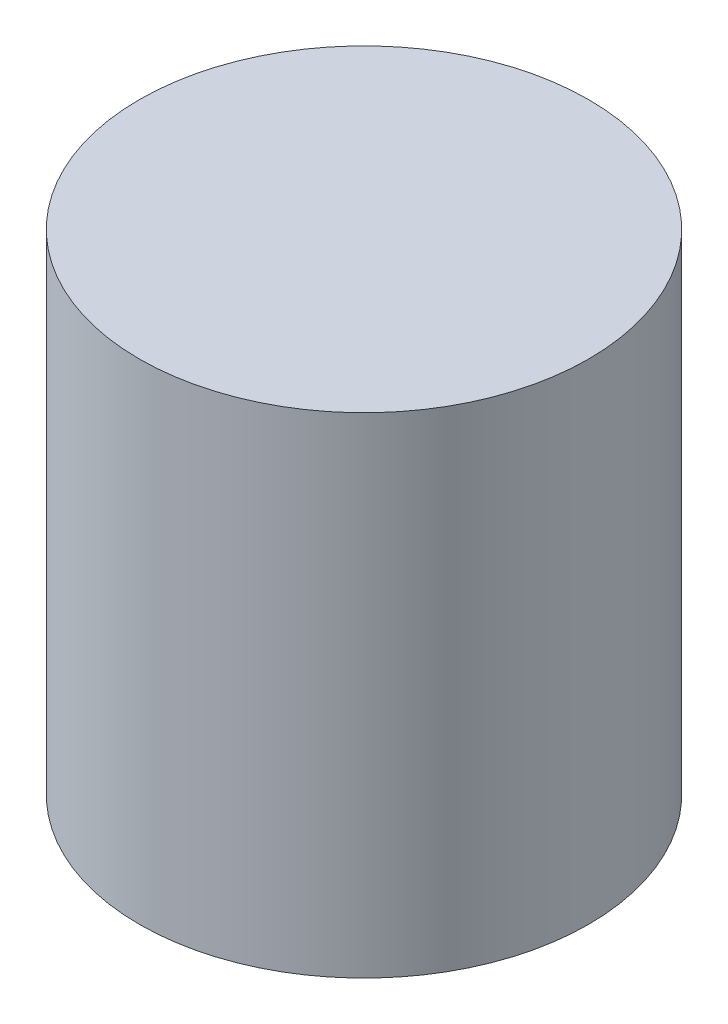
ISO-10303-21;
HEADER;
FILE_DESCRIPTION(('STEP AP214'),'2;1');
FILE_NAME('part.step','',(''),(''),'','','');
FILE_SCHEMA(('AUTOMOTIVE_DESIGN { 1 0 10303 214 1 1 1 1 }'));
ENDSEC;
DATA;
#1=APPLICATION_CONTEXT('core data for automotive mechanical design processes');
#2=APPLICATION_PROTOCOL_DEFINITION('international standard','automotive_design',2000,#1);
#3=PRODUCT_CONTEXT('',#1,'mechanical');
#4=PRODUCT('Part','Part','',(#3));
#5=PRODUCT_RELATED_PRODUCT_CATEGORY('part','',(#4));
#6=PRODUCT_DEFINITION_FORMATION('','',#4);
#7=PRODUCT_DEFINITION_CONTEXT('part definition',#1,'design');
#8=PRODUCT_DEFINITION('design','',#6,#7);
#9=PRODUCT_DEFINITION_SHAPE('','',#8);
#10=(LENGTH_UNIT() NAMED_UNIT(*) SI_UNIT(.MILLI.,.METRE.));
#11=(NAMED_UNIT(*) PLANE_ANGLE_UNIT() SI_UNIT($,.RADIAN.));
#12=(NAMED_UNIT(*) SI_UNIT($,.STERADIAN.) SOLID_ANGLE_UNIT());
#13=UNCERTAINTY_MEASURE_WITH_UNIT(LENGTH_MEASURE(1.E-05),#10,'distance_accuracy_value','');
#14=(GEOMETRIC_REPRESENTATION_CONTEXT(3) GLOBAL_UNCERTAINTY_ASSIGNED_CONTEXT((#13)) GLOBAL_UNIT_ASSIGNED_CONTEXT((#10,
#11,#12)) REPRESENTATION_CONTEXT('',''));
#15=CARTESIAN_POINT('',(0.,0.,0.));
#16=DIRECTION('',(0.,0.,1.));
#17=DIRECTION('',(1.,0.,0.));
#18=AXIS2_PLACEMENT_3D('',#15,#16,#17);
#19=CARTESIAN_POINT('',(0.,34.,0.));
#20=DIRECTION('',(0.,-1.,0.));
#21=DIRECTION('',(0.,0.,-1.));
#22=AXIS2_PLACEMENT_3D('',#19,#20,#21);
#23=CYLINDRICAL_SURFACE('',#22,15.6002233389168);
#24=CARTESIAN_POINT('',(0.,34.,0.));
#25=DIRECTION('',(0.,1.,0.));
#26=DIRECTION('',(0.,0.,1.));
#27=AXIS2_PLACEMENT_3D('',#24,#25,#26);
#28=CIRCLE('',#27,15.6002233389168);
#29=CARTESIAN_POINT('',(0.,34.,15.6002233389168));
#30=VERTEX_POINT('',#29);
#31=EDGE_CURVE('E10',#30,#30,#28,.T.);
#32=ORIENTED_EDGE('',*,*,#31,.F.);
#33=EDGE_LOOP('',(#32));
#34=FACE_BOUND('',#33,.T.);
#35=CARTESIAN_POINT('',(0.,0.,0.));
#36=DIRECTION('',(0.,1.,0.));
#37=DIRECTION('',(0.,0.,1.));
#38=AXIS2_PLACEMENT_3D('',#35,#36,#37);
#39=CIRCLE('',#38,15.6002233389168);
#40=CARTESIAN_POINT('',(0.,0.,15.6002233389168));
#41=VERTEX_POINT('',#40);
#42=EDGE_CURVE('E39',#41,#41,#39,.T.);
#43=ORIENTED_EDGE('',*,*,#42,.T.);
#44=EDGE_LOOP('',(#43));
#45=FACE_BOUND('',#44,.T.);
#46=ADVANCED_FACE('F36',(#34,#45),#23,.T.);
#47=CARTESIAN_POINT('',(0.,34.,0.));
#48=DIRECTION('',(0.,1.,0.));
#49=DIRECTION('',(0.,0.,1.));
#50=AXIS2_PLACEMENT_3D('',#47,#48,#49);
#51=PLANE('',#50);
#52=ORIENTED_EDGE('',*,*,#31,.T.);
#53=EDGE_LOOP('',(#52));
#54=FACE_BOUND('',#53,.T.);
#55=ADVANCED_FACE('F51',(#54),#51,.T.);
#56=CARTESIAN_POINT('',(0.,0.,0.));
#57=DIRECTION('',(0.,1.,0.));
#58=DIRECTION('',(0.,0.,1.));
#59=AXIS2_PLACEMENT_3D('',#56,#57,#58);
#60=PLANE('',#59);
#61=ORIENTED_EDGE('',*,*,#42,.F.);
#62=EDGE_LOOP('',(#61));
#63=FACE_BOUND('',#62,.T.);
#64=ADVANCED_FACE('F49',(#63),#60,.F.);
#65=CLOSED_SHELL('',(#46,#55,#64));
#66=MANIFOLD_SOLID_BREP('B2',#65);
#67=ADVANCED_BREP_SHAPE_REPRESENTATION('',(#18,#66),#14);
#68=SHAPE_DEFINITION_REPRESENTATION(#9,#67);
ENDSEC;
END-ISO-10303-21;
